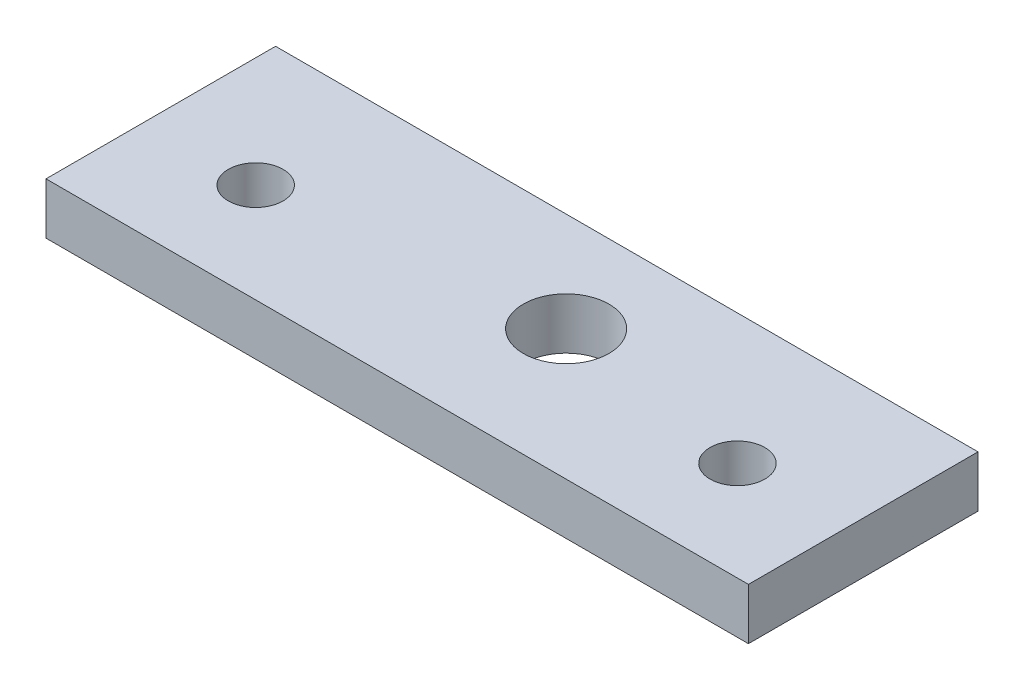
ISO-10303-21;
HEADER;
FILE_DESCRIPTION(('STEP AP214'),'2;1');
FILE_NAME('part.step','',(''),(''),'','','');
FILE_SCHEMA(('AUTOMOTIVE_DESIGN { 1 0 10303 214 1 1 1 1 }'));
ENDSEC;
DATA;
#1=APPLICATION_CONTEXT('core data for automotive mechanical design processes');
#2=APPLICATION_PROTOCOL_DEFINITION('international standard','automotive_design',2000,#1);
#3=PRODUCT_CONTEXT('',#1,'mechanical');
#4=PRODUCT('Part','Part','',(#3));
#5=PRODUCT_RELATED_PRODUCT_CATEGORY('part','',(#4));
#6=PRODUCT_DEFINITION_FORMATION('','',#4);
#7=PRODUCT_DEFINITION_CONTEXT('part definition',#1,'design');
#8=PRODUCT_DEFINITION('design','',#6,#7);
#9=PRODUCT_DEFINITION_SHAPE('','',#8);
#10=(LENGTH_UNIT() NAMED_UNIT(*) SI_UNIT(.MILLI.,.METRE.));
#11=(NAMED_UNIT(*) PLANE_ANGLE_UNIT() SI_UNIT($,.RADIAN.));
#12=(NAMED_UNIT(*) SI_UNIT($,.STERADIAN.) SOLID_ANGLE_UNIT());
#13=UNCERTAINTY_MEASURE_WITH_UNIT(LENGTH_MEASURE(1.E-05),#10,'distance_accuracy_value','');
#14=(GEOMETRIC_REPRESENTATION_CONTEXT(3) GLOBAL_UNCERTAINTY_ASSIGNED_CONTEXT((#13)) GLOBAL_UNIT_ASSIGNED_CONTEXT((#10,
#11,#12)) REPRESENTATION_CONTEXT('',''));
#15=CARTESIAN_POINT('',(0.,0.,0.));
#16=DIRECTION('',(0.,0.,1.));
#17=DIRECTION('',(1.,0.,0.));
#18=AXIS2_PLACEMENT_3D('',#15,#16,#17);
#19=CARTESIAN_POINT('',(0.,1.5,0.));
#20=DIRECTION('',(0.,-1.,0.));
#21=DIRECTION('',(0.,0.,-1.));
#22=AXIS2_PLACEMENT_3D('',#19,#20,#21);
#23=PLANE('',#22);
#24=DIRECTION('',(0.,0.,1.));
#25=VECTOR('',#24,1.);
#26=CARTESIAN_POINT('',(-9.52122037659416,1.5,2.04759051211956));
#27=LINE('',#26,#25);
#28=CARTESIAN_POINT('',(-9.52122037659416,1.5,-4.65240948788044));
#29=VERTEX_POINT('',#28);
#30=CARTESIAN_POINT('',(-9.52122037659416,1.5,2.04759051211956));
#31=VERTEX_POINT('',#30);
#32=EDGE_CURVE('E98',#29,#31,#27,.T.);
#33=ORIENTED_EDGE('',*,*,#32,.T.);
#34=DIRECTION('',(1.,0.,0.));
#35=VECTOR('',#34,1.);
#36=CARTESIAN_POINT('',(-9.52122037659416,1.5,2.04759051211956));
#37=LINE('',#36,#35);
#38=CARTESIAN_POINT('',(10.9787796234058,1.5,2.04759051211956));
#39=VERTEX_POINT('',#38);
#40=EDGE_CURVE('E93',#31,#39,#37,.T.);
#41=ORIENTED_EDGE('',*,*,#40,.T.);
#42=DIRECTION('',(0.,0.,-1.));
#43=VECTOR('',#42,1.);
#44=CARTESIAN_POINT('',(10.9787796234058,1.5,2.04759051211956));
#45=LINE('',#44,#43);
#46=CARTESIAN_POINT('',(10.9787796234058,1.5,-4.65240948788044));
#47=VERTEX_POINT('',#46);
#48=EDGE_CURVE('E96',#39,#47,#45,.T.);
#49=ORIENTED_EDGE('',*,*,#48,.T.);
#50=DIRECTION('',(-1.,0.,0.));
#51=VECTOR('',#50,1.);
#52=CARTESIAN_POINT('',(-9.52122037659416,1.5,-4.65240948788044));
#53=LINE('',#52,#51);
#54=EDGE_CURVE('E63',#47,#29,#53,.T.);
#55=ORIENTED_EDGE('',*,*,#54,.T.);
#56=EDGE_LOOP('',(#33,#41,#49,#55));
#57=FACE_BOUND('',#56,.T.);
#58=CARTESIAN_POINT('',(-6.30122037659416,1.5,-0.852409487880443));
#59=DIRECTION('',(0.,1.,0.));
#60=DIRECTION('',(0.,0.,1.));
#61=AXIS2_PLACEMENT_3D('',#58,#59,#60);
#62=CIRCLE('',#61,0.800000000000004);
#63=CARTESIAN_POINT('',(-6.30122037659416,1.5,-0.0524094878804383));
#64=VERTEX_POINT('',#63);
#65=EDGE_CURVE('E118',#64,#64,#62,.T.);
#66=ORIENTED_EDGE('',*,*,#65,.F.);
#67=EDGE_LOOP('',(#66));
#68=FACE_BOUND('',#67,.T.);
#69=CARTESIAN_POINT('',(1.85877962340584,1.5,-1.75240948788044));
#70=DIRECTION('',(0.,1.,0.));
#71=DIRECTION('',(0.,0.,1.));
#72=AXIS2_PLACEMENT_3D('',#69,#70,#71);
#73=CIRCLE('',#72,1.25);
#74=CARTESIAN_POINT('',(1.85877962340584,1.5,-0.502409487880443));
#75=VERTEX_POINT('',#74);
#76=EDGE_CURVE('E140',#75,#75,#73,.T.);
#77=ORIENTED_EDGE('',*,*,#76,.F.);
#78=EDGE_LOOP('',(#77));
#79=FACE_BOUND('',#78,.T.);
#80=CARTESIAN_POINT('',(7.75877962340584,1.5,-0.852409487880443));
#81=DIRECTION('',(0.,1.,0.));
#82=DIRECTION('',(0.,0.,1.));
#83=AXIS2_PLACEMENT_3D('',#80,#81,#82);
#84=CIRCLE('',#83,0.800000000000001);
#85=CARTESIAN_POINT('',(7.75877962340584,1.5,-0.052409487880442));
#86=VERTEX_POINT('',#85);
#87=EDGE_CURVE('E148',#86,#86,#84,.T.);
#88=ORIENTED_EDGE('',*,*,#87,.F.);
#89=EDGE_LOOP('',(#88));
#90=FACE_BOUND('',#89,.T.);
#91=ADVANCED_FACE('F45',(#57,#68,#79,#90),#23,.F.);
#92=CARTESIAN_POINT('',(0.,0.,0.));
#93=DIRECTION('',(0.,-1.,0.));
#94=DIRECTION('',(0.,0.,-1.));
#95=AXIS2_PLACEMENT_3D('',#92,#93,#94);
#96=PLANE('',#95);
#97=CARTESIAN_POINT('',(1.85877962340584,0.,-1.75240948788044));
#98=DIRECTION('',(0.,1.,0.));
#99=DIRECTION('',(0.,0.,1.));
#100=AXIS2_PLACEMENT_3D('',#97,#98,#99);
#101=CIRCLE('',#100,1.25);
#102=CARTESIAN_POINT('',(1.85877962340584,0.,-0.502409487880443));
#103=VERTEX_POINT('',#102);
#104=EDGE_CURVE('E144',#103,#103,#101,.T.);
#105=ORIENTED_EDGE('',*,*,#104,.T.);
#106=EDGE_LOOP('',(#105));
#107=FACE_BOUND('',#106,.T.);
#108=DIRECTION('',(0.,0.,1.));
#109=VECTOR('',#108,1.);
#110=CARTESIAN_POINT('',(-9.52122037659416,0.,2.04759051211956));
#111=LINE('',#110,#109);
#112=CARTESIAN_POINT('',(-9.52122037659416,0.,-4.65240948788044));
#113=VERTEX_POINT('',#112);
#114=CARTESIAN_POINT('',(-9.52122037659416,0.,2.04759051211956));
#115=VERTEX_POINT('',#114);
#116=EDGE_CURVE('E114',#113,#115,#111,.T.);
#117=ORIENTED_EDGE('',*,*,#116,.F.);
#118=DIRECTION('',(-1.,0.,0.));
#119=VECTOR('',#118,1.);
#120=CARTESIAN_POINT('',(-9.52122037659416,0.,-4.65240948788044));
#121=LINE('',#120,#119);
#122=CARTESIAN_POINT('',(10.9787796234058,0.,-4.65240948788044));
#123=VERTEX_POINT('',#122);
#124=EDGE_CURVE('E86',#123,#113,#121,.T.);
#125=ORIENTED_EDGE('',*,*,#124,.F.);
#126=DIRECTION('',(0.,0.,-1.));
#127=VECTOR('',#126,1.);
#128=CARTESIAN_POINT('',(10.9787796234058,0.,2.04759051211956));
#129=LINE('',#128,#127);
#130=CARTESIAN_POINT('',(10.9787796234058,0.,2.04759051211956));
#131=VERTEX_POINT('',#130);
#132=EDGE_CURVE('E80',#131,#123,#129,.T.);
#133=ORIENTED_EDGE('',*,*,#132,.F.);
#134=DIRECTION('',(1.,0.,0.));
#135=VECTOR('',#134,1.);
#136=CARTESIAN_POINT('',(-9.52122037659416,0.,2.04759051211956));
#137=LINE('',#136,#135);
#138=EDGE_CURVE('E103',#115,#131,#137,.T.);
#139=ORIENTED_EDGE('',*,*,#138,.F.);
#140=EDGE_LOOP('',(#117,#125,#133,#139));
#141=FACE_BOUND('',#140,.T.);
#142=CARTESIAN_POINT('',(-6.30122037659416,0.,-0.852409487880443));
#143=DIRECTION('',(0.,1.,0.));
#144=DIRECTION('',(0.,0.,1.));
#145=AXIS2_PLACEMENT_3D('',#142,#143,#144);
#146=CIRCLE('',#145,0.800000000000004);
#147=CARTESIAN_POINT('',(-6.30122037659416,0.,-0.0524094878804383));
#148=VERTEX_POINT('',#147);
#149=EDGE_CURVE('E136',#148,#148,#146,.T.);
#150=ORIENTED_EDGE('',*,*,#149,.T.);
#151=EDGE_LOOP('',(#150));
#152=FACE_BOUND('',#151,.T.);
#153=CARTESIAN_POINT('',(7.75877962340584,0.,-0.852409487880443));
#154=DIRECTION('',(0.,1.,0.));
#155=DIRECTION('',(0.,0.,1.));
#156=AXIS2_PLACEMENT_3D('',#153,#154,#155);
#157=CIRCLE('',#156,0.800000000000001);
#158=CARTESIAN_POINT('',(7.75877962340584,0.,-0.052409487880442));
#159=VERTEX_POINT('',#158);
#160=EDGE_CURVE('E152',#159,#159,#157,.T.);
#161=ORIENTED_EDGE('',*,*,#160,.T.);
#162=EDGE_LOOP('',(#161));
#163=FACE_BOUND('',#162,.T.);
#164=ADVANCED_FACE('F131',(#107,#141,#152,#163),#96,.T.);
#165=CARTESIAN_POINT('',(-9.52122037659416,1.5,2.04759051211956));
#166=DIRECTION('',(1.,0.,0.));
#167=DIRECTION('',(0.,0.,-1.));
#168=AXIS2_PLACEMENT_3D('',#165,#166,#167);
#169=PLANE('',#168);
#170=ORIENTED_EDGE('',*,*,#116,.T.);
#171=DIRECTION('',(0.,-1.,0.));
#172=VECTOR('',#171,1.);
#173=CARTESIAN_POINT('',(-9.52122037659416,1.5,2.04759051211956));
#174=LINE('',#173,#172);
#175=EDGE_CURVE('E11',#31,#115,#174,.T.);
#176=ORIENTED_EDGE('',*,*,#175,.F.);
#177=ORIENTED_EDGE('',*,*,#32,.F.);
#178=DIRECTION('',(0.,-1.,0.));
#179=VECTOR('',#178,1.);
#180=CARTESIAN_POINT('',(-9.52122037659416,1.5,-4.65240948788044));
#181=LINE('',#180,#179);
#182=EDGE_CURVE('E110',#29,#113,#181,.T.);
#183=ORIENTED_EDGE('',*,*,#182,.T.);
#184=EDGE_LOOP('',(#170,#176,#177,#183));
#185=FACE_BOUND('',#184,.T.);
#186=ADVANCED_FACE('F47',(#185),#169,.F.);
#187=CARTESIAN_POINT('',(-9.52122037659416,1.5,2.04759051211956));
#188=DIRECTION('',(0.,0.,-1.));
#189=DIRECTION('',(-1.,0.,0.));
#190=AXIS2_PLACEMENT_3D('',#187,#188,#189);
#191=PLANE('',#190);
#192=ORIENTED_EDGE('',*,*,#138,.T.);
#193=DIRECTION('',(0.,-1.,0.));
#194=VECTOR('',#193,1.);
#195=CARTESIAN_POINT('',(10.9787796234058,1.5,2.04759051211956));
#196=LINE('',#195,#194);
#197=EDGE_CURVE('E55',#39,#131,#196,.T.);
#198=ORIENTED_EDGE('',*,*,#197,.F.);
#199=ORIENTED_EDGE('',*,*,#40,.F.);
#200=ORIENTED_EDGE('',*,*,#175,.T.);
#201=EDGE_LOOP('',(#192,#198,#199,#200));
#202=FACE_BOUND('',#201,.T.);
#203=ADVANCED_FACE('F102',(#202),#191,.F.);
#204=CARTESIAN_POINT('',(10.9787796234058,1.5,2.04759051211956));
#205=DIRECTION('',(-1.,0.,0.));
#206=DIRECTION('',(0.,0.,1.));
#207=AXIS2_PLACEMENT_3D('',#204,#205,#206);
#208=PLANE('',#207);
#209=ORIENTED_EDGE('',*,*,#132,.T.);
#210=DIRECTION('',(0.,-1.,0.));
#211=VECTOR('',#210,1.);
#212=CARTESIAN_POINT('',(10.9787796234058,1.5,-4.65240948788044));
#213=LINE('',#212,#211);
#214=EDGE_CURVE('E105',#47,#123,#213,.T.);
#215=ORIENTED_EDGE('',*,*,#214,.F.);
#216=ORIENTED_EDGE('',*,*,#48,.F.);
#217=ORIENTED_EDGE('',*,*,#197,.T.);
#218=EDGE_LOOP('',(#209,#215,#216,#217));
#219=FACE_BOUND('',#218,.T.);
#220=ADVANCED_FACE('F106',(#219),#208,.F.);
#221=CARTESIAN_POINT('',(-9.52122037659416,1.5,-4.65240948788044));
#222=DIRECTION('',(0.,0.,1.));
#223=DIRECTION('',(1.,0.,0.));
#224=AXIS2_PLACEMENT_3D('',#221,#222,#223);
#225=PLANE('',#224);
#226=ORIENTED_EDGE('',*,*,#124,.T.);
#227=ORIENTED_EDGE('',*,*,#182,.F.);
#228=ORIENTED_EDGE('',*,*,#54,.F.);
#229=ORIENTED_EDGE('',*,*,#214,.T.);
#230=EDGE_LOOP('',(#226,#227,#228,#229));
#231=FACE_BOUND('',#230,.T.);
#232=ADVANCED_FACE('F128',(#231),#225,.F.);
#233=CARTESIAN_POINT('',(-6.30122037659416,1.5,-0.852409487880443));
#234=DIRECTION('',(0.,-1.,0.));
#235=DIRECTION('',(0.,0.,-1.));
#236=AXIS2_PLACEMENT_3D('',#233,#234,#235);
#237=CYLINDRICAL_SURFACE('',#236,0.800000000000004);
#238=ORIENTED_EDGE('',*,*,#65,.T.);
#239=EDGE_LOOP('',(#238));
#240=FACE_BOUND('',#239,.T.);
#241=ORIENTED_EDGE('',*,*,#149,.F.);
#242=EDGE_LOOP('',(#241));
#243=FACE_BOUND('',#242,.T.);
#244=ADVANCED_FACE('F171',(#240,#243),#237,.F.);
#245=CARTESIAN_POINT('',(1.85877962340584,1.5,-1.75240948788044));
#246=DIRECTION('',(0.,-1.,0.));
#247=DIRECTION('',(0.,0.,-1.));
#248=AXIS2_PLACEMENT_3D('',#245,#246,#247);
#249=CYLINDRICAL_SURFACE('',#248,1.25);
#250=ORIENTED_EDGE('',*,*,#76,.T.);
#251=EDGE_LOOP('',(#250));
#252=FACE_BOUND('',#251,.T.);
#253=ORIENTED_EDGE('',*,*,#104,.F.);
#254=EDGE_LOOP('',(#253));
#255=FACE_BOUND('',#254,.T.);
#256=ADVANCED_FACE('F216',(#252,#255),#249,.F.);
#257=CARTESIAN_POINT('',(7.75877962340584,1.5,-0.852409487880443));
#258=DIRECTION('',(0.,-1.,0.));
#259=DIRECTION('',(0.,0.,-1.));
#260=AXIS2_PLACEMENT_3D('',#257,#258,#259);
#261=CYLINDRICAL_SURFACE('',#260,0.800000000000001);
#262=ORIENTED_EDGE('',*,*,#87,.T.);
#263=EDGE_LOOP('',(#262));
#264=FACE_BOUND('',#263,.T.);
#265=ORIENTED_EDGE('',*,*,#160,.F.);
#266=EDGE_LOOP('',(#265));
#267=FACE_BOUND('',#266,.T.);
#268=ADVANCED_FACE('F160',(#264,#267),#261,.F.);
#269=CLOSED_SHELL('',(#91,#164,#186,#203,#220,#232,#244,#256,#268));
#270=MANIFOLD_SOLID_BREP('B2',#269);
#271=ADVANCED_BREP_SHAPE_REPRESENTATION('',(#18,#270),#14);
#272=SHAPE_DEFINITION_REPRESENTATION(#9,#271);
ENDSEC;
END-ISO-10303-21;
